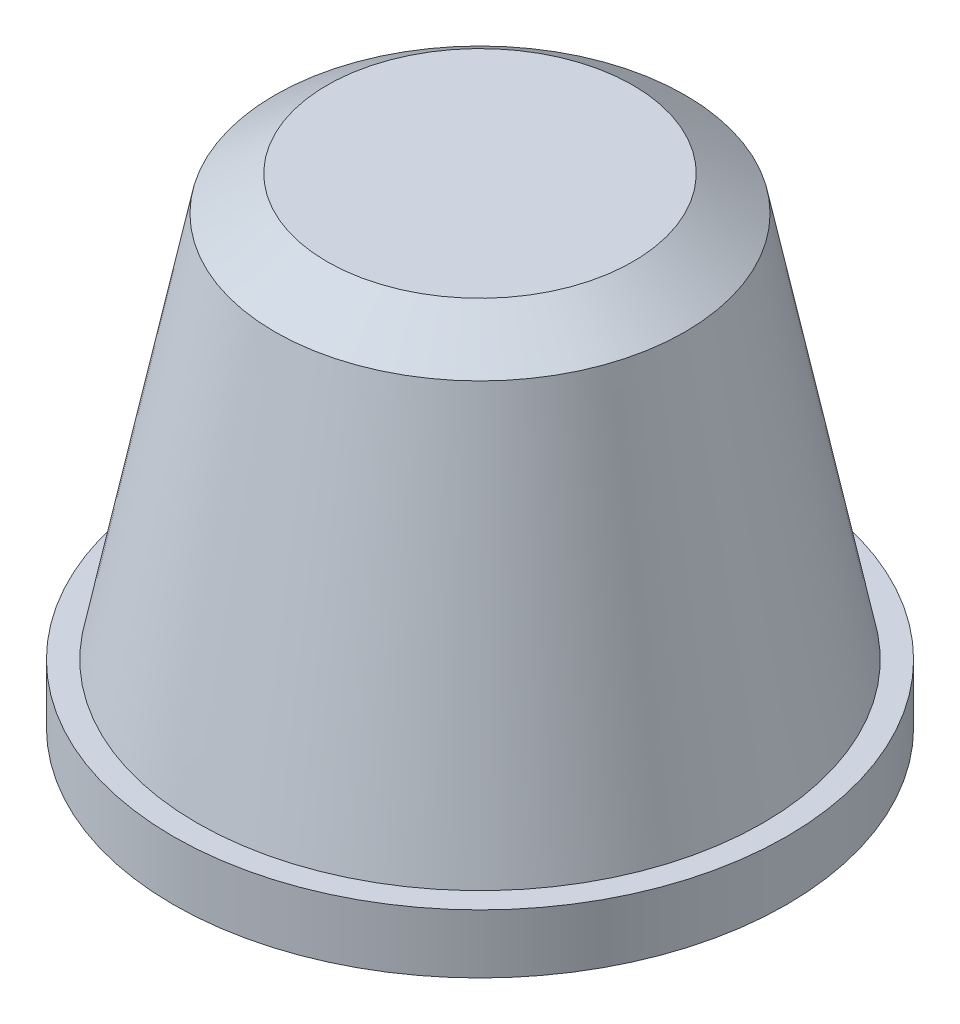
ISO-10303-21;
HEADER;
FILE_DESCRIPTION(('STEP AP214'),'2;1');
FILE_NAME('part.step','',(''),(''),'','','');
FILE_SCHEMA(('AUTOMOTIVE_DESIGN { 1 0 10303 214 1 1 1 1 }'));
ENDSEC;
DATA;
#1=APPLICATION_CONTEXT('core data for automotive mechanical design processes');
#2=APPLICATION_PROTOCOL_DEFINITION('international standard','automotive_design',2000,#1);
#3=PRODUCT_CONTEXT('',#1,'mechanical');
#4=PRODUCT('Part','Part','',(#3));
#5=PRODUCT_RELATED_PRODUCT_CATEGORY('part','',(#4));
#6=PRODUCT_DEFINITION_FORMATION('','',#4);
#7=PRODUCT_DEFINITION_CONTEXT('part definition',#1,'design');
#8=PRODUCT_DEFINITION('design','',#6,#7);
#9=PRODUCT_DEFINITION_SHAPE('','',#8);
#10=(LENGTH_UNIT() NAMED_UNIT(*) SI_UNIT(.MILLI.,.METRE.));
#11=(NAMED_UNIT(*) PLANE_ANGLE_UNIT() SI_UNIT($,.RADIAN.));
#12=(NAMED_UNIT(*) SI_UNIT($,.STERADIAN.) SOLID_ANGLE_UNIT());
#13=UNCERTAINTY_MEASURE_WITH_UNIT(LENGTH_MEASURE(1.E-05),#10,'distance_accuracy_value','');
#14=(GEOMETRIC_REPRESENTATION_CONTEXT(3) GLOBAL_UNCERTAINTY_ASSIGNED_CONTEXT((#13)) GLOBAL_UNIT_ASSIGNED_CONTEXT((#10,
#11,#12)) REPRESENTATION_CONTEXT('',''));
#15=CARTESIAN_POINT('',(0.,0.,0.));
#16=DIRECTION('',(0.,0.,1.));
#17=DIRECTION('',(1.,0.,0.));
#18=AXIS2_PLACEMENT_3D('',#15,#16,#17);
#19=CARTESIAN_POINT('',(-6.85804458967687,-0.361411223792671,0.));
#20=DIRECTION('',(0.,-1.,0.));
#21=DIRECTION('',(0.,0.,-1.));
#22=AXIS2_PLACEMENT_3D('',#19,#20,#21);
#23=PLANE('',#22);
#24=CARTESIAN_POINT('',(-6.85804458967687,-0.361411223792671,0.));
#25=DIRECTION('',(0.,1.,0.));
#26=DIRECTION('',(0.,0.,1.));
#27=AXIS2_PLACEMENT_3D('',#24,#25,#26);
#28=CIRCLE('',#27,26.);
#29=CARTESIAN_POINT('',(-6.85804458967687,-0.361411223792671,26.));
#30=VERTEX_POINT('',#29);
#31=EDGE_CURVE('E69',#30,#30,#28,.T.);
#32=ORIENTED_EDGE('',*,*,#31,.F.);
#33=EDGE_LOOP('',(#32));
#34=FACE_BOUND('',#33,.T.);
#35=ADVANCED_FACE('F54',(#34),#23,.T.);
#36=CARTESIAN_POINT('',(-6.85804458967687,40.339683475479,0.));
#37=DIRECTION('',(0.,1.,0.));
#38=DIRECTION('',(0.,0.,1.));
#39=AXIS2_PLACEMENT_3D('',#36,#37,#38);
#40=CYLINDRICAL_SURFACE('',#39,26.);
#41=ORIENTED_EDGE('',*,*,#31,.T.);
#42=EDGE_LOOP('',(#41));
#43=FACE_BOUND('',#42,.T.);
#44=CARTESIAN_POINT('',(-6.85804458967687,4.63858877620733,0.));
#45=DIRECTION('',(0.,1.,0.));
#46=DIRECTION('',(0.,0.,1.));
#47=AXIS2_PLACEMENT_3D('',#44,#45,#46);
#48=CIRCLE('',#47,26.);
#49=CARTESIAN_POINT('',(-6.85804458967687,4.63858877620733,26.));
#50=VERTEX_POINT('',#49);
#51=EDGE_CURVE('E75',#50,#50,#48,.T.);
#52=ORIENTED_EDGE('',*,*,#51,.F.);
#53=EDGE_LOOP('',(#52));
#54=FACE_BOUND('',#53,.T.);
#55=ADVANCED_FACE('F91',(#43,#54),#40,.T.);
#56=CARTESIAN_POINT('',(-32.8580445896769,4.63858877620733,0.));
#57=DIRECTION('',(0.,1.,0.));
#58=DIRECTION('',(0.,0.,1.));
#59=AXIS2_PLACEMENT_3D('',#56,#57,#58);
#60=PLANE('',#59);
#61=ORIENTED_EDGE('',*,*,#51,.T.);
#62=EDGE_LOOP('',(#61));
#63=FACE_BOUND('',#62,.T.);
#64=CARTESIAN_POINT('',(-6.85804458967687,4.63858877620733,0.));
#65=DIRECTION('',(0.,1.,0.));
#66=DIRECTION('',(0.,0.,1.));
#67=AXIS2_PLACEMENT_3D('',#64,#65,#66);
#68=CIRCLE('',#67,24.);
#69=CARTESIAN_POINT('',(-6.85804458967687,4.63858877620733,24.));
#70=VERTEX_POINT('',#69);
#71=EDGE_CURVE('E81',#70,#70,#68,.T.);
#72=ORIENTED_EDGE('',*,*,#71,.F.);
#73=EDGE_LOOP('',(#72));
#74=FACE_BOUND('',#73,.T.);
#75=ADVANCED_FACE('F89',(#63,#74),#60,.T.);
#76=CARTESIAN_POINT('',(-6.85804458967687,40.339683475479,0.));
#77=DIRECTION('',(0.,-1.,0.));
#78=DIRECTION('',(0.,0.,-1.));
#79=AXIS2_PLACEMENT_3D('',#76,#77,#78);
#80=CONICAL_SURFACE('',#79,16.8014169069052,0.198966987697801);
#81=CARTESIAN_POINT('',(-6.85804458967687,37.398869627241,0.));
#82=DIRECTION('',(0.,1.,0.));
#83=DIRECTION('',(0.,0.,1.));
#84=AXIS2_PLACEMENT_3D('',#81,#82,#83);
#85=CIRCLE('',#84,17.3943873193306);
#86=CARTESIAN_POINT('',(-6.85804458967687,37.398869627241,17.3943873193306));
#87=VERTEX_POINT('',#86);
#88=EDGE_CURVE('E12',#87,#87,#85,.F.);
#89=ORIENTED_EDGE('',*,*,#88,.T.);
#90=EDGE_LOOP('',(#89));
#91=FACE_BOUND('',#90,.T.);
#92=ORIENTED_EDGE('',*,*,#71,.T.);
#93=EDGE_LOOP('',(#92));
#94=FACE_BOUND('',#93,.T.);
#95=ADVANCED_FACE('F87',(#91,#94),#80,.T.);
#96=CARTESIAN_POINT('',(-23.6594614965821,40.339683475479,0.));
#97=DIRECTION('',(0.,1.,0.));
#98=DIRECTION('',(0.,0.,1.));
#99=AXIS2_PLACEMENT_3D('',#96,#97,#98);
#100=PLANE('',#99);
#101=CARTESIAN_POINT('',(-6.85804458967687,40.339683475479,0.));
#102=DIRECTION('',(0.,1.,0.));
#103=DIRECTION('',(0.,0.,1.));
#104=AXIS2_PLACEMENT_3D('',#101,#102,#103);
#105=CIRCLE('',#104,12.9681118991183);
#106=CARTESIAN_POINT('',(-6.85804458967687,40.339683475479,12.9681118991183));
#107=VERTEX_POINT('',#106);
#108=EDGE_CURVE('E63',#107,#107,#105,.T.);
#109=ORIENTED_EDGE('',*,*,#108,.T.);
#110=EDGE_LOOP('',(#109));
#111=FACE_BOUND('',#110,.T.);
#112=ADVANCED_FACE('F98',(#111),#100,.T.);
#113=CARTESIAN_POINT('',(-6.85804458967687,40.339683475479,0.));
#114=DIRECTION('',(0.,-1.,0.));
#115=DIRECTION('',(0.,0.,-1.));
#116=AXIS2_PLACEMENT_3D('',#113,#114,#115);
#117=CONICAL_SURFACE('',#116,12.9681118991183,0.984365151095249);
#118=ORIENTED_EDGE('',*,*,#88,.F.);
#119=EDGE_LOOP('',(#118));
#120=FACE_BOUND('',#119,.T.);
#121=ORIENTED_EDGE('',*,*,#108,.F.);
#122=EDGE_LOOP('',(#121));
#123=FACE_BOUND('',#122,.T.);
#124=ADVANCED_FACE('F57',(#120,#123),#117,.T.);
#125=CLOSED_SHELL('',(#35,#55,#75,#95,#112,#124));
#126=MANIFOLD_SOLID_BREP('B2',#125);
#127=ADVANCED_BREP_SHAPE_REPRESENTATION('',(#18,#126),#14);
#128=SHAPE_DEFINITION_REPRESENTATION(#9,#127);
ENDSEC;
END-ISO-10303-21;
